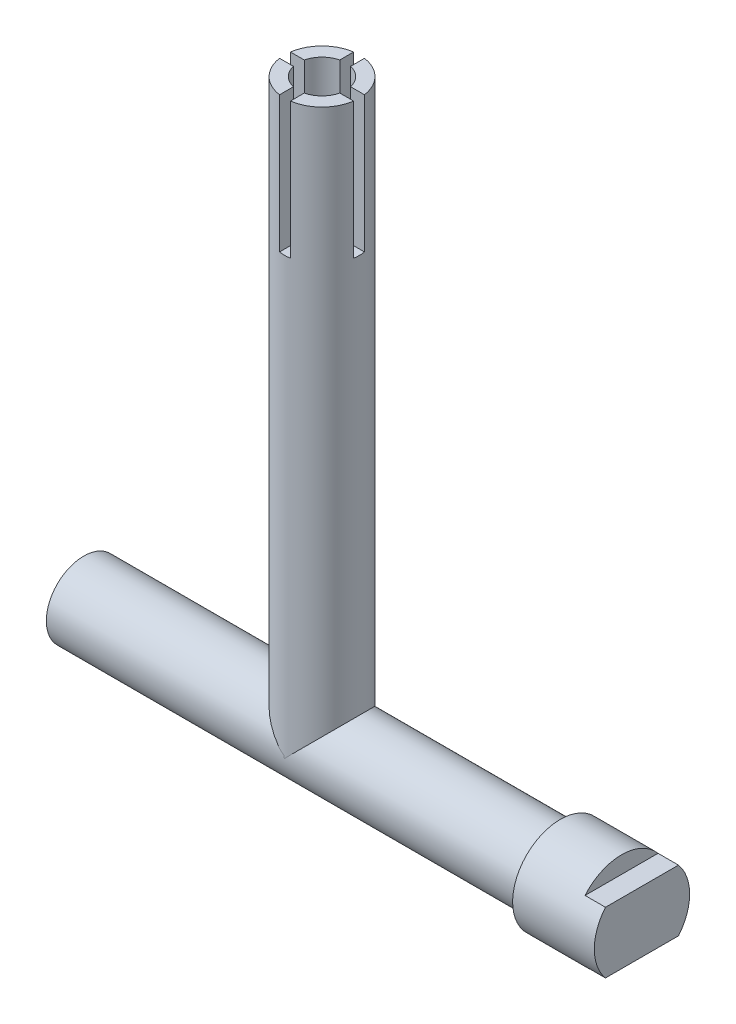
ISO-10303-21;
HEADER;
FILE_DESCRIPTION(('STEP AP214'),'2;1');
FILE_NAME('part.step','',(''),(''),'','','');
FILE_SCHEMA(('AUTOMOTIVE_DESIGN { 1 0 10303 214 1 1 1 1 }'));
ENDSEC;
DATA;
#1=APPLICATION_CONTEXT('core data for automotive mechanical design processes');
#2=APPLICATION_PROTOCOL_DEFINITION('international standard','automotive_design',2000,#1);
#3=PRODUCT_CONTEXT('',#1,'mechanical');
#4=PRODUCT('Part','Part','',(#3));
#5=PRODUCT_RELATED_PRODUCT_CATEGORY('part','',(#4));
#6=PRODUCT_DEFINITION_FORMATION('','',#4);
#7=PRODUCT_DEFINITION_CONTEXT('part definition',#1,'design');
#8=PRODUCT_DEFINITION('design','',#6,#7);
#9=PRODUCT_DEFINITION_SHAPE('','',#8);
#10=(LENGTH_UNIT() NAMED_UNIT(*) SI_UNIT(.MILLI.,.METRE.));
#11=(NAMED_UNIT(*) PLANE_ANGLE_UNIT() SI_UNIT($,.RADIAN.));
#12=(NAMED_UNIT(*) SI_UNIT($,.STERADIAN.) SOLID_ANGLE_UNIT());
#13=UNCERTAINTY_MEASURE_WITH_UNIT(LENGTH_MEASURE(1.E-05),#10,'distance_accuracy_value','');
#14=(GEOMETRIC_REPRESENTATION_CONTEXT(3) GLOBAL_UNCERTAINTY_ASSIGNED_CONTEXT((#13)) GLOBAL_UNIT_ASSIGNED_CONTEXT((#10,
#11,#12)) REPRESENTATION_CONTEXT('',''));
#15=CARTESIAN_POINT('',(0.,0.,0.));
#16=DIRECTION('',(0.,0.,1.));
#17=DIRECTION('',(1.,0.,0.));
#18=AXIS2_PLACEMENT_3D('',#15,#16,#17);
#19=CARTESIAN_POINT('',(35.,0.,0.));
#20=DIRECTION('',(-1.,0.,0.));
#21=DIRECTION('',(0.,0.,1.));
#22=AXIS2_PLACEMENT_3D('',#19,#20,#21);
#23=CYLINDRICAL_SURFACE('',#22,2.75);
#24=CARTESIAN_POINT('',(17.5,0.,0.));
#25=DIRECTION('',(-0.707106781186548,-0.707106781186547,0.));
#26=DIRECTION('',(0.707106781186548,-0.707106781186547,0.));
#27=AXIS2_PLACEMENT_3D('',#24,#25,#26);
#28=ELLIPSE('',#27,3.88908729652601,2.75);
#29=CARTESIAN_POINT('',(17.5,0.,2.75));
#30=VERTEX_POINT('',#29);
#31=CARTESIAN_POINT('',(17.5,0.,-2.75));
#32=VERTEX_POINT('',#31);
#33=EDGE_CURVE('E53',#30,#32,#28,.T.);
#34=ORIENTED_EDGE('',*,*,#33,.T.);
#35=CARTESIAN_POINT('',(17.5,0.,0.));
#36=DIRECTION('',(0.707106781186548,-0.707106781186547,0.));
#37=DIRECTION('',(-0.707106781186548,-0.707106781186547,0.));
#38=AXIS2_PLACEMENT_3D('',#35,#36,#37);
#39=ELLIPSE('',#38,3.88908729652601,2.75);
#40=EDGE_CURVE('E12',#32,#30,#39,.T.);
#41=ORIENTED_EDGE('',*,*,#40,.T.);
#42=EDGE_LOOP('',(#34,#41));
#43=FACE_BOUND('',#42,.T.);
#44=ADVANCED_FACE('F50',(#43),#23,.F.);
#45=CARTESIAN_POINT('',(17.5,42.,0.));
#46=DIRECTION('',(0.,-1.,0.));
#47=DIRECTION('',(0.,0.,-1.));
#48=AXIS2_PLACEMENT_3D('',#45,#46,#47);
#49=CYLINDRICAL_SURFACE('',#48,2.75);
#50=DIRECTION('',(0.,-1.,0.));
#51=VECTOR('',#50,1.);
#52=CARTESIAN_POINT('',(20.2207535720826,42.,-0.400000000000017));
#53=LINE('',#52,#51);
#54=CARTESIAN_POINT('',(20.2207535720826,32.,-0.400000000000017));
#55=VERTEX_POINT('',#54);
#56=CARTESIAN_POINT('',(20.2207535720826,42.,-0.400000000000017));
#57=VERTEX_POINT('',#56);
#58=EDGE_CURVE('E334',#55,#57,#53,.F.);
#59=ORIENTED_EDGE('',*,*,#58,.F.);
#60=CARTESIAN_POINT('',(17.5,32.,0.));
#61=DIRECTION('',(0.,1.,0.));
#62=DIRECTION('',(0.,0.,1.));
#63=AXIS2_PLACEMENT_3D('',#60,#61,#62);
#64=CIRCLE('',#63,2.75);
#65=CARTESIAN_POINT('',(20.2207535720826,32.,0.399999999999982));
#66=VERTEX_POINT('',#65);
#67=EDGE_CURVE('E326',#66,#55,#64,.T.);
#68=ORIENTED_EDGE('',*,*,#67,.F.);
#69=DIRECTION('',(0.,-1.,0.));
#70=VECTOR('',#69,1.);
#71=CARTESIAN_POINT('',(20.2207535720826,42.,0.399999999999982));
#72=LINE('',#71,#70);
#73=CARTESIAN_POINT('',(20.2207535720826,42.,0.399999999999982));
#74=VERTEX_POINT('',#73);
#75=EDGE_CURVE('E331',#66,#74,#72,.F.);
#76=ORIENTED_EDGE('',*,*,#75,.T.);
#77=CARTESIAN_POINT('',(17.5,42.,0.));
#78=DIRECTION('',(0.,1.,0.));
#79=DIRECTION('',(0.,0.,1.));
#80=AXIS2_PLACEMENT_3D('',#77,#78,#79);
#81=CIRCLE('',#80,2.75);
#82=CARTESIAN_POINT('',(17.9,42.,2.72075357208256));
#83=VERTEX_POINT('',#82);
#84=EDGE_CURVE('E208',#83,#74,#81,.T.);
#85=ORIENTED_EDGE('',*,*,#84,.F.);
#86=DIRECTION('',(0.,-1.,0.));
#87=VECTOR('',#86,1.);
#88=CARTESIAN_POINT('',(17.9,42.,2.72075357208256));
#89=LINE('',#88,#87);
#90=CARTESIAN_POINT('',(17.9,32.,2.72075357208256));
#91=VERTEX_POINT('',#90);
#92=EDGE_CURVE('E324',#83,#91,#89,.T.);
#93=ORIENTED_EDGE('',*,*,#92,.T.);
#94=CARTESIAN_POINT('',(17.1,32.,2.72075357208256));
#95=VERTEX_POINT('',#94);
#96=EDGE_CURVE('E312',#95,#91,#64,.T.);
#97=ORIENTED_EDGE('',*,*,#96,.F.);
#98=DIRECTION('',(0.,-1.,0.));
#99=VECTOR('',#98,1.);
#100=CARTESIAN_POINT('',(17.1,42.,2.72075357208256));
#101=LINE('',#100,#99);
#102=CARTESIAN_POINT('',(17.1,42.,2.72075357208256));
#103=VERTEX_POINT('',#102);
#104=EDGE_CURVE('E321',#103,#95,#101,.T.);
#105=ORIENTED_EDGE('',*,*,#104,.F.);
#106=CARTESIAN_POINT('',(14.7792464279174,42.,0.399999999999982));
#107=VERTEX_POINT('',#106);
#108=EDGE_CURVE('E207',#107,#103,#81,.T.);
#109=ORIENTED_EDGE('',*,*,#108,.F.);
#110=DIRECTION('',(0.,-1.,0.));
#111=VECTOR('',#110,1.);
#112=CARTESIAN_POINT('',(14.7792464279174,42.,0.399999999999982));
#113=LINE('',#112,#111);
#114=CARTESIAN_POINT('',(14.7792464279174,32.,0.399999999999982));
#115=VERTEX_POINT('',#114);
#116=EDGE_CURVE('E314',#107,#115,#113,.T.);
#117=ORIENTED_EDGE('',*,*,#116,.T.);
#118=CARTESIAN_POINT('',(14.7792464279174,32.,-0.400000000000017));
#119=VERTEX_POINT('',#118);
#120=EDGE_CURVE('E304',#119,#115,#64,.T.);
#121=ORIENTED_EDGE('',*,*,#120,.F.);
#122=DIRECTION('',(0.,-1.,0.));
#123=VECTOR('',#122,1.);
#124=CARTESIAN_POINT('',(14.7792464279174,42.,-0.400000000000017));
#125=LINE('',#124,#123);
#126=CARTESIAN_POINT('',(14.7792464279174,42.,-0.400000000000017));
#127=VERTEX_POINT('',#126);
#128=EDGE_CURVE('E322',#127,#119,#125,.T.);
#129=ORIENTED_EDGE('',*,*,#128,.F.);
#130=CARTESIAN_POINT('',(17.1,42.,-2.72075357208256));
#131=VERTEX_POINT('',#130);
#132=EDGE_CURVE('E348',#131,#127,#81,.T.);
#133=ORIENTED_EDGE('',*,*,#132,.F.);
#134=DIRECTION('',(0.,-1.,0.));
#135=VECTOR('',#134,1.);
#136=CARTESIAN_POINT('',(17.1,42.,-2.72075357208256));
#137=LINE('',#136,#135);
#138=CARTESIAN_POINT('',(17.1,32.,-2.72075357208256));
#139=VERTEX_POINT('',#138);
#140=EDGE_CURVE('E173',#139,#131,#137,.F.);
#141=ORIENTED_EDGE('',*,*,#140,.F.);
#142=CARTESIAN_POINT('',(17.9,32.,-2.72075357208256));
#143=VERTEX_POINT('',#142);
#144=EDGE_CURVE('E311',#143,#139,#64,.T.);
#145=ORIENTED_EDGE('',*,*,#144,.F.);
#146=DIRECTION('',(0.,-1.,0.));
#147=VECTOR('',#146,1.);
#148=CARTESIAN_POINT('',(17.9,42.,-2.72075357208256));
#149=LINE('',#148,#147);
#150=CARTESIAN_POINT('',(17.9,42.,-2.72075357208256));
#151=VERTEX_POINT('',#150);
#152=EDGE_CURVE('E335',#143,#151,#149,.F.);
#153=ORIENTED_EDGE('',*,*,#152,.T.);
#154=EDGE_CURVE('E212',#57,#151,#81,.T.);
#155=ORIENTED_EDGE('',*,*,#154,.F.);
#156=EDGE_LOOP('',(#59,#68,#76,#85,#93,#97,#105,#109,#117,#121,#129,#133,#141,#145,#153,#155));
#157=FACE_BOUND('',#156,.T.);
#158=ORIENTED_EDGE('',*,*,#33,.F.);
#159=ORIENTED_EDGE('',*,*,#40,.F.);
#160=EDGE_LOOP('',(#158,#159));
#161=FACE_BOUND('',#160,.T.);
#162=ADVANCED_FACE('F233',(#157,#161),#49,.T.);
#163=CARTESIAN_POINT('',(17.5,42.,0.));
#164=DIRECTION('',(0.,1.,0.));
#165=DIRECTION('',(0.,0.,1.));
#166=AXIS2_PLACEMENT_3D('',#163,#164,#165);
#167=PLANE('',#166);
#168=CARTESIAN_POINT('',(17.5,42.,0.));
#169=DIRECTION('',(0.,1.,0.));
#170=DIRECTION('',(0.,0.,1.));
#171=AXIS2_PLACEMENT_3D('',#168,#169,#170);
#172=CIRCLE('',#171,1.75);
#173=CARTESIAN_POINT('',(17.1,42.,-1.70367250374008));
#174=VERTEX_POINT('',#173);
#175=CARTESIAN_POINT('',(15.7963274962599,42.,-0.400000000000017));
#176=VERTEX_POINT('',#175);
#177=EDGE_CURVE('E186',#174,#176,#172,.T.);
#178=ORIENTED_EDGE('',*,*,#177,.F.);
#179=DIRECTION('',(0.,0.,-1.));
#180=VECTOR('',#179,1.);
#181=CARTESIAN_POINT('',(17.1,42.,0.));
#182=LINE('',#181,#180);
#183=EDGE_CURVE('E166',#174,#131,#182,.T.);
#184=ORIENTED_EDGE('',*,*,#183,.T.);
#185=ORIENTED_EDGE('',*,*,#132,.T.);
#186=DIRECTION('',(1.,0.,0.));
#187=VECTOR('',#186,1.);
#188=CARTESIAN_POINT('',(0.,42.,-0.400000000000017));
#189=LINE('',#188,#187);
#190=EDGE_CURVE('E178',#127,#176,#189,.T.);
#191=ORIENTED_EDGE('',*,*,#190,.T.);
#192=EDGE_LOOP('',(#178,#184,#185,#191));
#193=FACE_BOUND('',#192,.T.);
#194=ADVANCED_FACE('F193',(#193),#167,.T.);
#195=DIRECTION('',(0.,0.,-1.));
#196=VECTOR('',#195,1.);
#197=CARTESIAN_POINT('',(17.9,42.,0.));
#198=LINE('',#197,#196);
#199=CARTESIAN_POINT('',(17.9,42.,-1.70367250374008));
#200=VERTEX_POINT('',#199);
#201=EDGE_CURVE('E346',#200,#151,#198,.T.);
#202=ORIENTED_EDGE('',*,*,#201,.F.);
#203=CARTESIAN_POINT('',(19.2036725037401,42.,-0.400000000000017));
#204=VERTEX_POINT('',#203);
#205=EDGE_CURVE('E194',#204,#200,#172,.T.);
#206=ORIENTED_EDGE('',*,*,#205,.F.);
#207=DIRECTION('',(1.,0.,0.));
#208=VECTOR('',#207,1.);
#209=CARTESIAN_POINT('',(0.,42.,-0.400000000000017));
#210=LINE('',#209,#208);
#211=EDGE_CURVE('E347',#204,#57,#210,.T.);
#212=ORIENTED_EDGE('',*,*,#211,.T.);
#213=ORIENTED_EDGE('',*,*,#154,.T.);
#214=EDGE_LOOP('',(#202,#206,#212,#213));
#215=FACE_BOUND('',#214,.T.);
#216=ADVANCED_FACE('F240',(#215),#167,.T.);
#217=ORIENTED_EDGE('',*,*,#108,.T.);
#218=DIRECTION('',(0.,0.,-1.));
#219=VECTOR('',#218,1.);
#220=CARTESIAN_POINT('',(17.1,42.,0.));
#221=LINE('',#220,#219);
#222=CARTESIAN_POINT('',(17.1,42.,1.70367250374008));
#223=VERTEX_POINT('',#222);
#224=EDGE_CURVE('E351',#103,#223,#221,.T.);
#225=ORIENTED_EDGE('',*,*,#224,.T.);
#226=CARTESIAN_POINT('',(15.7963274962599,42.,0.399999999999982));
#227=VERTEX_POINT('',#226);
#228=EDGE_CURVE('E195',#227,#223,#172,.T.);
#229=ORIENTED_EDGE('',*,*,#228,.F.);
#230=DIRECTION('',(1.,0.,0.));
#231=VECTOR('',#230,1.);
#232=CARTESIAN_POINT('',(0.,42.,0.399999999999982));
#233=LINE('',#232,#231);
#234=EDGE_CURVE('E352',#107,#227,#233,.T.);
#235=ORIENTED_EDGE('',*,*,#234,.F.);
#236=EDGE_LOOP('',(#217,#225,#229,#235));
#237=FACE_BOUND('',#236,.T.);
#238=ADVANCED_FACE('F249',(#237),#167,.T.);
#239=CARTESIAN_POINT('',(17.5,42.,0.));
#240=DIRECTION('',(0.,1.,0.));
#241=DIRECTION('',(0.,0.,1.));
#242=AXIS2_PLACEMENT_3D('',#239,#240,#241);
#243=CYLINDRICAL_SURFACE('',#242,1.75);
#244=CARTESIAN_POINT('',(17.5,32.,0.));
#245=DIRECTION('',(0.,1.,0.));
#246=DIRECTION('',(0.,0.,1.));
#247=AXIS2_PLACEMENT_3D('',#244,#245,#246);
#248=CIRCLE('',#247,1.75);
#249=CARTESIAN_POINT('',(15.7963274962599,32.,0.399999999999982));
#250=VERTEX_POINT('',#249);
#251=CARTESIAN_POINT('',(15.7963274962599,32.,-0.400000000000017));
#252=VERTEX_POINT('',#251);
#253=EDGE_CURVE('E189',#250,#252,#248,.F.);
#254=ORIENTED_EDGE('',*,*,#253,.F.);
#255=DIRECTION('',(0.,1.,0.));
#256=VECTOR('',#255,1.);
#257=CARTESIAN_POINT('',(15.7963274962599,42.,0.399999999999982));
#258=LINE('',#257,#256);
#259=EDGE_CURVE('E229',#250,#227,#258,.T.);
#260=ORIENTED_EDGE('',*,*,#259,.T.);
#261=ORIENTED_EDGE('',*,*,#228,.T.);
#262=DIRECTION('',(0.,1.,0.));
#263=VECTOR('',#262,1.);
#264=CARTESIAN_POINT('',(17.1,42.,1.70367250374008));
#265=LINE('',#264,#263);
#266=CARTESIAN_POINT('',(17.1,32.,1.70367250374008));
#267=VERTEX_POINT('',#266);
#268=EDGE_CURVE('E214',#267,#223,#265,.T.);
#269=ORIENTED_EDGE('',*,*,#268,.F.);
#270=CARTESIAN_POINT('',(17.9,32.,1.70367250374008));
#271=VERTEX_POINT('',#270);
#272=EDGE_CURVE('E211',#271,#267,#248,.F.);
#273=ORIENTED_EDGE('',*,*,#272,.F.);
#274=DIRECTION('',(0.,1.,0.));
#275=VECTOR('',#274,1.);
#276=CARTESIAN_POINT('',(17.9,42.,1.70367250374008));
#277=LINE('',#276,#275);
#278=CARTESIAN_POINT('',(17.9,42.,1.70367250374008));
#279=VERTEX_POINT('',#278);
#280=EDGE_CURVE('E217',#271,#279,#277,.T.);
#281=ORIENTED_EDGE('',*,*,#280,.T.);
#282=CARTESIAN_POINT('',(19.2036725037401,42.,0.399999999999982));
#283=VERTEX_POINT('',#282);
#284=EDGE_CURVE('E198',#279,#283,#172,.T.);
#285=ORIENTED_EDGE('',*,*,#284,.T.);
#286=DIRECTION('',(0.,1.,0.));
#287=VECTOR('',#286,1.);
#288=CARTESIAN_POINT('',(19.2036725037401,42.,0.399999999999982));
#289=LINE('',#288,#287);
#290=CARTESIAN_POINT('',(19.2036725037401,32.,0.399999999999982));
#291=VERTEX_POINT('',#290);
#292=EDGE_CURVE('E220',#283,#291,#289,.F.);
#293=ORIENTED_EDGE('',*,*,#292,.T.);
#294=CARTESIAN_POINT('',(19.2036725037401,32.,-0.400000000000017));
#295=VERTEX_POINT('',#294);
#296=EDGE_CURVE('E215',#295,#291,#248,.F.);
#297=ORIENTED_EDGE('',*,*,#296,.F.);
#298=DIRECTION('',(0.,1.,0.));
#299=VECTOR('',#298,1.);
#300=CARTESIAN_POINT('',(19.2036725037401,42.,-0.400000000000017));
#301=LINE('',#300,#299);
#302=EDGE_CURVE('E223',#204,#295,#301,.F.);
#303=ORIENTED_EDGE('',*,*,#302,.F.);
#304=ORIENTED_EDGE('',*,*,#205,.T.);
#305=DIRECTION('',(0.,1.,0.));
#306=VECTOR('',#305,1.);
#307=CARTESIAN_POINT('',(17.9,42.,-1.70367250374008));
#308=LINE('',#307,#306);
#309=CARTESIAN_POINT('',(17.9,32.,-1.70367250374008));
#310=VERTEX_POINT('',#309);
#311=EDGE_CURVE('E190',#200,#310,#308,.F.);
#312=ORIENTED_EDGE('',*,*,#311,.T.);
#313=CARTESIAN_POINT('',(17.1,32.,-1.70367250374008));
#314=VERTEX_POINT('',#313);
#315=EDGE_CURVE('E188',#314,#310,#248,.F.);
#316=ORIENTED_EDGE('',*,*,#315,.F.);
#317=DIRECTION('',(0.,1.,0.));
#318=VECTOR('',#317,1.);
#319=CARTESIAN_POINT('',(17.1,42.,-1.70367250374008));
#320=LINE('',#319,#318);
#321=EDGE_CURVE('E170',#174,#314,#320,.F.);
#322=ORIENTED_EDGE('',*,*,#321,.F.);
#323=ORIENTED_EDGE('',*,*,#177,.T.);
#324=DIRECTION('',(0.,1.,0.));
#325=VECTOR('',#324,1.);
#326=CARTESIAN_POINT('',(15.7963274962599,42.,-0.400000000000017));
#327=LINE('',#326,#325);
#328=EDGE_CURVE('E227',#252,#176,#327,.T.);
#329=ORIENTED_EDGE('',*,*,#328,.F.);
#330=EDGE_LOOP('',(#254,#260,#261,#269,#273,#281,#285,#293,#297,#303,#304,#312,#316,#322,#323,#329));
#331=FACE_BOUND('',#330,.T.);
#332=CARTESIAN_POINT('',(17.5,29.,0.));
#333=DIRECTION('',(0.,1.,0.));
#334=DIRECTION('',(0.,0.,1.));
#335=AXIS2_PLACEMENT_3D('',#332,#333,#334);
#336=CIRCLE('',#335,1.75);
#337=CARTESIAN_POINT('',(17.5,29.,1.75));
#338=VERTEX_POINT('',#337);
#339=EDGE_CURVE('E203',#338,#338,#336,.T.);
#340=ORIENTED_EDGE('',*,*,#339,.F.);
#341=EDGE_LOOP('',(#340));
#342=FACE_BOUND('',#341,.T.);
#343=ADVANCED_FACE('F183',(#331,#342),#243,.F.);
#344=DIRECTION('',(1.,0.,0.));
#345=VECTOR('',#344,1.);
#346=CARTESIAN_POINT('',(0.,42.,0.399999999999982));
#347=LINE('',#346,#345);
#348=EDGE_CURVE('E359',#283,#74,#347,.T.);
#349=ORIENTED_EDGE('',*,*,#348,.F.);
#350=ORIENTED_EDGE('',*,*,#284,.F.);
#351=DIRECTION('',(0.,0.,-1.));
#352=VECTOR('',#351,1.);
#353=CARTESIAN_POINT('',(17.9,42.,0.));
#354=LINE('',#353,#352);
#355=EDGE_CURVE('E354',#83,#279,#354,.T.);
#356=ORIENTED_EDGE('',*,*,#355,.F.);
#357=ORIENTED_EDGE('',*,*,#84,.T.);
#358=EDGE_LOOP('',(#349,#350,#356,#357));
#359=FACE_BOUND('',#358,.T.);
#360=ADVANCED_FACE('F242',(#359),#167,.T.);
#361=CARTESIAN_POINT('',(17.5,29.,0.));
#362=DIRECTION('',(0.,1.,0.));
#363=DIRECTION('',(0.,0.,1.));
#364=AXIS2_PLACEMENT_3D('',#361,#362,#363);
#365=CONICAL_SURFACE('',#364,1.75,1.02974425867665);
#366=CARTESIAN_POINT('',(17.5,27.9484939167018,0.));
#367=VERTEX_POINT('',#366);
#368=VERTEX_LOOP('',#367);
#369=FACE_BOUND('',#368,.T.);
#370=ORIENTED_EDGE('',*,*,#339,.T.);
#371=EDGE_LOOP('',(#370));
#372=FACE_BOUND('',#371,.T.);
#373=ADVANCED_FACE('F247',(#369,#372),#365,.F.);
#374=CARTESIAN_POINT('',(0.,32.,0.));
#375=DIRECTION('',(0.,1.,0.));
#376=DIRECTION('',(0.,0.,1.));
#377=AXIS2_PLACEMENT_3D('',#374,#375,#376);
#378=PLANE('',#377);
#379=ORIENTED_EDGE('',*,*,#96,.T.);
#380=DIRECTION('',(0.,0.,-1.));
#381=VECTOR('',#380,1.);
#382=CARTESIAN_POINT('',(17.9,32.,0.));
#383=LINE('',#382,#381);
#384=EDGE_CURVE('E378',#91,#271,#383,.T.);
#385=ORIENTED_EDGE('',*,*,#384,.T.);
#386=ORIENTED_EDGE('',*,*,#272,.T.);
#387=DIRECTION('',(0.,0.,-1.));
#388=VECTOR('',#387,1.);
#389=CARTESIAN_POINT('',(17.1,32.,0.));
#390=LINE('',#389,#388);
#391=EDGE_CURVE('E316',#95,#267,#390,.T.);
#392=ORIENTED_EDGE('',*,*,#391,.F.);
#393=EDGE_LOOP('',(#379,#385,#386,#392));
#394=FACE_BOUND('',#393,.T.);
#395=ADVANCED_FACE('F252',(#394),#378,.T.);
#396=CARTESIAN_POINT('',(17.1,32.,0.));
#397=DIRECTION('',(1.,0.,0.));
#398=DIRECTION('',(0.,0.,-1.));
#399=AXIS2_PLACEMENT_3D('',#396,#397,#398);
#400=PLANE('',#399);
#401=ORIENTED_EDGE('',*,*,#104,.T.);
#402=ORIENTED_EDGE('',*,*,#391,.T.);
#403=ORIENTED_EDGE('',*,*,#268,.T.);
#404=ORIENTED_EDGE('',*,*,#224,.F.);
#405=EDGE_LOOP('',(#401,#402,#403,#404));
#406=FACE_BOUND('',#405,.T.);
#407=ADVANCED_FACE('F267',(#406),#400,.T.);
#408=CARTESIAN_POINT('',(17.9,32.,0.));
#409=DIRECTION('',(1.,0.,0.));
#410=DIRECTION('',(0.,0.,-1.));
#411=AXIS2_PLACEMENT_3D('',#408,#409,#410);
#412=PLANE('',#411);
#413=ORIENTED_EDGE('',*,*,#355,.T.);
#414=ORIENTED_EDGE('',*,*,#280,.F.);
#415=ORIENTED_EDGE('',*,*,#384,.F.);
#416=ORIENTED_EDGE('',*,*,#92,.F.);
#417=EDGE_LOOP('',(#413,#414,#415,#416));
#418=FACE_BOUND('',#417,.T.);
#419=ADVANCED_FACE('F270',(#418),#412,.F.);
#420=ORIENTED_EDGE('',*,*,#67,.T.);
#421=DIRECTION('',(1.,0.,0.));
#422=VECTOR('',#421,1.);
#423=CARTESIAN_POINT('',(0.,32.,-0.400000000000017));
#424=LINE('',#423,#422);
#425=EDGE_CURVE('E367',#295,#55,#424,.T.);
#426=ORIENTED_EDGE('',*,*,#425,.F.);
#427=ORIENTED_EDGE('',*,*,#296,.T.);
#428=DIRECTION('',(1.,0.,0.));
#429=VECTOR('',#428,1.);
#430=CARTESIAN_POINT('',(0.,32.,0.399999999999982));
#431=LINE('',#430,#429);
#432=EDGE_CURVE('E375',#291,#66,#431,.T.);
#433=ORIENTED_EDGE('',*,*,#432,.T.);
#434=EDGE_LOOP('',(#420,#426,#427,#433));
#435=FACE_BOUND('',#434,.T.);
#436=ADVANCED_FACE('F274',(#435),#378,.T.);
#437=CARTESIAN_POINT('',(0.,32.,0.399999999999982));
#438=DIRECTION('',(0.,0.,1.));
#439=DIRECTION('',(1.,0.,0.));
#440=AXIS2_PLACEMENT_3D('',#437,#438,#439);
#441=PLANE('',#440);
#442=ORIENTED_EDGE('',*,*,#432,.F.);
#443=ORIENTED_EDGE('',*,*,#292,.F.);
#444=ORIENTED_EDGE('',*,*,#348,.T.);
#445=ORIENTED_EDGE('',*,*,#75,.F.);
#446=EDGE_LOOP('',(#442,#443,#444,#445));
#447=FACE_BOUND('',#446,.T.);
#448=ADVANCED_FACE('F276',(#447),#441,.F.);
#449=CARTESIAN_POINT('',(0.,32.,-0.400000000000017));
#450=DIRECTION('',(0.,0.,1.));
#451=DIRECTION('',(1.,0.,0.));
#452=AXIS2_PLACEMENT_3D('',#449,#450,#451);
#453=PLANE('',#452);
#454=ORIENTED_EDGE('',*,*,#58,.T.);
#455=ORIENTED_EDGE('',*,*,#211,.F.);
#456=ORIENTED_EDGE('',*,*,#302,.T.);
#457=ORIENTED_EDGE('',*,*,#425,.T.);
#458=EDGE_LOOP('',(#454,#455,#456,#457));
#459=FACE_BOUND('',#458,.T.);
#460=ADVANCED_FACE('F279',(#459),#453,.T.);
#461=ORIENTED_EDGE('',*,*,#144,.T.);
#462=DIRECTION('',(0.,0.,-1.));
#463=VECTOR('',#462,1.);
#464=CARTESIAN_POINT('',(17.1,32.,0.));
#465=LINE('',#464,#463);
#466=EDGE_CURVE('E362',#314,#139,#465,.T.);
#467=ORIENTED_EDGE('',*,*,#466,.F.);
#468=ORIENTED_EDGE('',*,*,#315,.T.);
#469=DIRECTION('',(0.,0.,-1.));
#470=VECTOR('',#469,1.);
#471=CARTESIAN_POINT('',(17.9,32.,0.));
#472=LINE('',#471,#470);
#473=EDGE_CURVE('E363',#310,#143,#472,.T.);
#474=ORIENTED_EDGE('',*,*,#473,.T.);
#475=EDGE_LOOP('',(#461,#467,#468,#474));
#476=FACE_BOUND('',#475,.T.);
#477=ADVANCED_FACE('F283',(#476),#378,.T.);
#478=CARTESIAN_POINT('',(17.9,32.,0.));
#479=DIRECTION('',(1.,0.,0.));
#480=DIRECTION('',(0.,0.,-1.));
#481=AXIS2_PLACEMENT_3D('',#478,#479,#480);
#482=PLANE('',#481);
#483=ORIENTED_EDGE('',*,*,#473,.F.);
#484=ORIENTED_EDGE('',*,*,#311,.F.);
#485=ORIENTED_EDGE('',*,*,#201,.T.);
#486=ORIENTED_EDGE('',*,*,#152,.F.);
#487=EDGE_LOOP('',(#483,#484,#485,#486));
#488=FACE_BOUND('',#487,.T.);
#489=ADVANCED_FACE('F259',(#488),#482,.F.);
#490=CARTESIAN_POINT('',(17.1,32.,0.));
#491=DIRECTION('',(1.,0.,0.));
#492=DIRECTION('',(0.,0.,-1.));
#493=AXIS2_PLACEMENT_3D('',#490,#491,#492);
#494=PLANE('',#493);
#495=ORIENTED_EDGE('',*,*,#140,.T.);
#496=ORIENTED_EDGE('',*,*,#183,.F.);
#497=ORIENTED_EDGE('',*,*,#321,.T.);
#498=ORIENTED_EDGE('',*,*,#466,.T.);
#499=EDGE_LOOP('',(#495,#496,#497,#498));
#500=FACE_BOUND('',#499,.T.);
#501=ADVANCED_FACE('F168',(#500),#494,.T.);
#502=CARTESIAN_POINT('',(0.,32.,0.399999999999982));
#503=DIRECTION('',(0.,0.,1.));
#504=DIRECTION('',(1.,0.,0.));
#505=AXIS2_PLACEMENT_3D('',#502,#503,#504);
#506=PLANE('',#505);
#507=ORIENTED_EDGE('',*,*,#234,.T.);
#508=ORIENTED_EDGE('',*,*,#259,.F.);
#509=DIRECTION('',(1.,0.,0.));
#510=VECTOR('',#509,1.);
#511=CARTESIAN_POINT('',(0.,32.,0.399999999999982));
#512=LINE('',#511,#510);
#513=EDGE_CURVE('E306',#115,#250,#512,.T.);
#514=ORIENTED_EDGE('',*,*,#513,.F.);
#515=ORIENTED_EDGE('',*,*,#116,.F.);
#516=EDGE_LOOP('',(#507,#508,#514,#515));
#517=FACE_BOUND('',#516,.T.);
#518=ADVANCED_FACE('F258',(#517),#506,.F.);
#519=CARTESIAN_POINT('',(0.,32.,-0.400000000000017));
#520=DIRECTION('',(0.,0.,1.));
#521=DIRECTION('',(1.,0.,0.));
#522=AXIS2_PLACEMENT_3D('',#519,#520,#521);
#523=PLANE('',#522);
#524=ORIENTED_EDGE('',*,*,#128,.T.);
#525=DIRECTION('',(1.,0.,0.));
#526=VECTOR('',#525,1.);
#527=CARTESIAN_POINT('',(0.,32.,-0.400000000000017));
#528=LINE('',#527,#526);
#529=EDGE_CURVE('E308',#119,#252,#528,.T.);
#530=ORIENTED_EDGE('',*,*,#529,.T.);
#531=ORIENTED_EDGE('',*,*,#328,.T.);
#532=ORIENTED_EDGE('',*,*,#190,.F.);
#533=EDGE_LOOP('',(#524,#530,#531,#532));
#534=FACE_BOUND('',#533,.T.);
#535=ADVANCED_FACE('F260',(#534),#523,.T.);
#536=ORIENTED_EDGE('',*,*,#120,.T.);
#537=ORIENTED_EDGE('',*,*,#513,.T.);
#538=ORIENTED_EDGE('',*,*,#253,.T.);
#539=ORIENTED_EDGE('',*,*,#529,.F.);
#540=EDGE_LOOP('',(#536,#537,#538,#539));
#541=FACE_BOUND('',#540,.T.);
#542=ADVANCED_FACE('F243',(#541),#378,.T.);
#543=CLOSED_SHELL('',(#44,#162,#194,#216,#238,#343,#360,#373,#395,#407,#419,#436,#448,#460,#477,
#489,#501,#518,#535,#542));
#544=MANIFOLD_SOLID_BREP('B2',#543);
#545=CARTESIAN_POINT('',(41.,0.,0.));
#546=DIRECTION('',(-1.,0.,0.));
#547=DIRECTION('',(0.,0.,1.));
#548=AXIS2_PLACEMENT_3D('',#545,#546,#547);
#549=CYLINDRICAL_SURFACE('',#548,3.5);
#550=CARTESIAN_POINT('',(35.,0.,0.));
#551=DIRECTION('',(1.,0.,0.));
#552=DIRECTION('',(0.,0.,-1.));
#553=AXIS2_PLACEMENT_3D('',#550,#551,#552);
#554=CIRCLE('',#553,3.5);
#555=CARTESIAN_POINT('',(35.,0.,-3.5));
#556=VERTEX_POINT('',#555);
#557=EDGE_CURVE('E727',#556,#556,#554,.T.);
#558=ORIENTED_EDGE('',*,*,#557,.T.);
#559=EDGE_LOOP('',(#558));
#560=FACE_BOUND('',#559,.T.);
#561=DIRECTION('',(1.,0.,0.));
#562=VECTOR('',#561,1.);
#563=CARTESIAN_POINT('',(39.5,-2.25,2.6809513236909));
#564=LINE('',#563,#562);
#565=CARTESIAN_POINT('',(39.5,-2.25,2.6809513236909));
#566=VERTEX_POINT('',#565);
#567=CARTESIAN_POINT('',(41.,-2.25,2.6809513236909));
#568=VERTEX_POINT('',#567);
#569=EDGE_CURVE('E712',#566,#568,#564,.T.);
#570=ORIENTED_EDGE('',*,*,#569,.T.);
#571=CARTESIAN_POINT('',(41.,0.,0.));
#572=DIRECTION('',(1.,0.,0.));
#573=DIRECTION('',(0.,0.,-1.));
#574=AXIS2_PLACEMENT_3D('',#571,#572,#573);
#575=CIRCLE('',#574,3.5);
#576=CARTESIAN_POINT('',(41.,2.25,2.6809513236909));
#577=VERTEX_POINT('',#576);
#578=EDGE_CURVE('E729',#577,#568,#575,.T.);
#579=ORIENTED_EDGE('',*,*,#578,.F.);
#580=DIRECTION('',(1.,0.,0.));
#581=VECTOR('',#580,1.);
#582=CARTESIAN_POINT('',(39.5,2.25,2.6809513236909));
#583=LINE('',#582,#581);
#584=CARTESIAN_POINT('',(39.5,2.25,2.6809513236909));
#585=VERTEX_POINT('',#584);
#586=EDGE_CURVE('E664',#585,#577,#583,.T.);
#587=ORIENTED_EDGE('',*,*,#586,.F.);
#588=CARTESIAN_POINT('',(39.5,0.,0.));
#589=DIRECTION('',(1.,0.,0.));
#590=DIRECTION('',(0.,0.,-1.));
#591=AXIS2_PLACEMENT_3D('',#588,#589,#590);
#592=CIRCLE('',#591,3.5);
#593=CARTESIAN_POINT('',(39.5,2.25,-2.6809513236909));
#594=VERTEX_POINT('',#593);
#595=EDGE_CURVE('E718',#594,#585,#592,.T.);
#596=ORIENTED_EDGE('',*,*,#595,.F.);
#597=DIRECTION('',(1.,0.,0.));
#598=VECTOR('',#597,1.);
#599=CARTESIAN_POINT('',(39.5,2.25,-2.6809513236909));
#600=LINE('',#599,#598);
#601=CARTESIAN_POINT('',(41.,2.25,-2.6809513236909));
#602=VERTEX_POINT('',#601);
#603=EDGE_CURVE('E724',#594,#602,#600,.T.);
#604=ORIENTED_EDGE('',*,*,#603,.T.);
#605=CARTESIAN_POINT('',(41.,-2.25,-2.6809513236909));
#606=VERTEX_POINT('',#605);
#607=EDGE_CURVE('E732',#606,#602,#575,.T.);
#608=ORIENTED_EDGE('',*,*,#607,.F.);
#609=DIRECTION('',(1.,0.,0.));
#610=VECTOR('',#609,1.);
#611=CARTESIAN_POINT('',(39.5,-2.25,-2.6809513236909));
#612=LINE('',#611,#610);
#613=CARTESIAN_POINT('',(39.5,-2.25,-2.6809513236909));
#614=VERTEX_POINT('',#613);
#615=EDGE_CURVE('E656',#614,#606,#612,.T.);
#616=ORIENTED_EDGE('',*,*,#615,.F.);
#617=CARTESIAN_POINT('',(39.5,0.,0.));
#618=DIRECTION('',(1.,0.,0.));
#619=DIRECTION('',(0.,0.,-1.));
#620=AXIS2_PLACEMENT_3D('',#617,#618,#619);
#621=CIRCLE('',#620,3.5);
#622=EDGE_CURVE('E709',#566,#614,#621,.T.);
#623=ORIENTED_EDGE('',*,*,#622,.F.);
#624=EDGE_LOOP('',(#570,#579,#587,#596,#604,#608,#616,#623));
#625=FACE_BOUND('',#624,.T.);
#626=ADVANCED_FACE('F641',(#560,#625),#549,.T.);
#627=CARTESIAN_POINT('',(41.,0.,0.));
#628=DIRECTION('',(1.,0.,0.));
#629=DIRECTION('',(0.,0.,-1.));
#630=AXIS2_PLACEMENT_3D('',#627,#628,#629);
#631=PLANE('',#630);
#632=ORIENTED_EDGE('',*,*,#578,.T.);
#633=DIRECTION('',(0.,0.,-1.));
#634=VECTOR('',#633,1.);
#635=CARTESIAN_POINT('',(41.,-2.25,0.));
#636=LINE('',#635,#634);
#637=EDGE_CURVE('E705',#568,#606,#636,.T.);
#638=ORIENTED_EDGE('',*,*,#637,.T.);
#639=ORIENTED_EDGE('',*,*,#607,.T.);
#640=DIRECTION('',(0.,0.,-1.));
#641=VECTOR('',#640,1.);
#642=CARTESIAN_POINT('',(41.,2.25,0.));
#643=LINE('',#642,#641);
#644=EDGE_CURVE('E715',#577,#602,#643,.T.);
#645=ORIENTED_EDGE('',*,*,#644,.F.);
#646=EDGE_LOOP('',(#632,#638,#639,#645));
#647=FACE_BOUND('',#646,.T.);
#648=ADVANCED_FACE('F738',(#647),#631,.T.);
#649=CARTESIAN_POINT('',(35.,0.,0.));
#650=DIRECTION('',(-1.,0.,0.));
#651=DIRECTION('',(0.,0.,1.));
#652=AXIS2_PLACEMENT_3D('',#649,#650,#651);
#653=CYLINDRICAL_SURFACE('',#652,2.75);
#654=CARTESIAN_POINT('',(35.,0.,0.));
#655=DIRECTION('',(1.,0.,0.));
#656=DIRECTION('',(0.,0.,-1.));
#657=AXIS2_PLACEMENT_3D('',#654,#655,#656);
#658=CIRCLE('',#657,2.75);
#659=CARTESIAN_POINT('',(35.,0.,-2.75));
#660=VERTEX_POINT('',#659);
#661=EDGE_CURVE('E48',#660,#660,#658,.T.);
#662=ORIENTED_EDGE('',*,*,#661,.F.);
#663=EDGE_LOOP('',(#662));
#664=FACE_BOUND('',#663,.T.);
#665=CARTESIAN_POINT('',(0.,0.,0.));
#666=DIRECTION('',(1.,0.,0.));
#667=DIRECTION('',(0.,0.,-1.));
#668=AXIS2_PLACEMENT_3D('',#665,#666,#667);
#669=CIRCLE('',#668,2.75);
#670=CARTESIAN_POINT('',(0.,0.,-2.75));
#671=VERTEX_POINT('',#670);
#672=EDGE_CURVE('E645',#671,#671,#669,.T.);
#673=ORIENTED_EDGE('',*,*,#672,.T.);
#674=EDGE_LOOP('',(#673));
#675=FACE_BOUND('',#674,.T.);
#676=ADVANCED_FACE('F643',(#664,#675),#653,.T.);
#677=CARTESIAN_POINT('',(0.,0.,0.));
#678=DIRECTION('',(1.,0.,0.));
#679=DIRECTION('',(0.,0.,-1.));
#680=AXIS2_PLACEMENT_3D('',#677,#678,#679);
#681=PLANE('',#680);
#682=CARTESIAN_POINT('',(0.,0.,0.));
#683=DIRECTION('',(-1.,0.,0.));
#684=DIRECTION('',(0.,0.,1.));
#685=AXIS2_PLACEMENT_3D('',#682,#683,#684);
#686=CIRCLE('',#685,2.);
#687=CARTESIAN_POINT('',(0.,0.,2.));
#688=VERTEX_POINT('',#687);
#689=EDGE_CURVE('E695',#688,#688,#686,.T.);
#690=ORIENTED_EDGE('',*,*,#689,.F.);
#691=EDGE_LOOP('',(#690));
#692=FACE_BOUND('',#691,.T.);
#693=ORIENTED_EDGE('',*,*,#672,.F.);
#694=EDGE_LOOP('',(#693));
#695=FACE_BOUND('',#694,.T.);
#696=ADVANCED_FACE('F763',(#692,#695),#681,.F.);
#697=CARTESIAN_POINT('',(35.,0.,0.));
#698=DIRECTION('',(1.,0.,0.));
#699=DIRECTION('',(0.,0.,-1.));
#700=AXIS2_PLACEMENT_3D('',#697,#698,#699);
#701=PLANE('',#700);
#702=ORIENTED_EDGE('',*,*,#557,.F.);
#703=EDGE_LOOP('',(#702));
#704=FACE_BOUND('',#703,.T.);
#705=ORIENTED_EDGE('',*,*,#661,.T.);
#706=EDGE_LOOP('',(#705));
#707=FACE_BOUND('',#706,.T.);
#708=ADVANCED_FACE('F754',(#704,#707),#701,.F.);
#709=CARTESIAN_POINT('',(39.5,2.25,0.));
#710=DIRECTION('',(0.,-1.,0.));
#711=DIRECTION('',(0.,0.,-1.));
#712=AXIS2_PLACEMENT_3D('',#709,#710,#711);
#713=PLANE('',#712);
#714=ORIENTED_EDGE('',*,*,#644,.T.);
#715=ORIENTED_EDGE('',*,*,#603,.F.);
#716=DIRECTION('',(0.,0.,-1.));
#717=VECTOR('',#716,1.);
#718=CARTESIAN_POINT('',(39.5,2.25,0.));
#719=LINE('',#718,#717);
#720=EDGE_CURVE('E720',#585,#594,#719,.T.);
#721=ORIENTED_EDGE('',*,*,#720,.F.);
#722=ORIENTED_EDGE('',*,*,#586,.T.);
#723=EDGE_LOOP('',(#714,#715,#721,#722));
#724=FACE_BOUND('',#723,.T.);
#725=ADVANCED_FACE('F741',(#724),#713,.F.);
#726=CARTESIAN_POINT('',(39.5,0.,0.));
#727=DIRECTION('',(1.,0.,0.));
#728=DIRECTION('',(0.,0.,-1.));
#729=AXIS2_PLACEMENT_3D('',#726,#727,#728);
#730=PLANE('',#729);
#731=ORIENTED_EDGE('',*,*,#595,.T.);
#732=ORIENTED_EDGE('',*,*,#720,.T.);
#733=EDGE_LOOP('',(#731,#732));
#734=FACE_BOUND('',#733,.T.);
#735=ADVANCED_FACE('F744',(#734),#730,.T.);
#736=CARTESIAN_POINT('',(39.5,-2.25,0.));
#737=DIRECTION('',(0.,-1.,0.));
#738=DIRECTION('',(0.,0.,-1.));
#739=AXIS2_PLACEMENT_3D('',#736,#737,#738);
#740=PLANE('',#739);
#741=ORIENTED_EDGE('',*,*,#637,.F.);
#742=ORIENTED_EDGE('',*,*,#569,.F.);
#743=DIRECTION('',(0.,0.,-1.));
#744=VECTOR('',#743,1.);
#745=CARTESIAN_POINT('',(39.5,-2.25,0.));
#746=LINE('',#745,#744);
#747=EDGE_CURVE('E707',#566,#614,#746,.T.);
#748=ORIENTED_EDGE('',*,*,#747,.T.);
#749=ORIENTED_EDGE('',*,*,#615,.T.);
#750=EDGE_LOOP('',(#741,#742,#748,#749));
#751=FACE_BOUND('',#750,.T.);
#752=ADVANCED_FACE('F746',(#751),#740,.T.);
#753=CARTESIAN_POINT('',(39.5,0.,0.));
#754=DIRECTION('',(1.,0.,0.));
#755=DIRECTION('',(0.,0.,-1.));
#756=AXIS2_PLACEMENT_3D('',#753,#754,#755);
#757=PLANE('',#756);
#758=ORIENTED_EDGE('',*,*,#747,.F.);
#759=ORIENTED_EDGE('',*,*,#622,.T.);
#760=EDGE_LOOP('',(#758,#759));
#761=FACE_BOUND('',#760,.T.);
#762=ADVANCED_FACE('F752',(#761),#757,.T.);
#763=CARTESIAN_POINT('',(7.,0.,0.));
#764=DIRECTION('',(-1.,0.,0.));
#765=DIRECTION('',(0.,0.,1.));
#766=AXIS2_PLACEMENT_3D('',#763,#764,#765);
#767=CYLINDRICAL_SURFACE('',#766,2.);
#768=CARTESIAN_POINT('',(7.,0.,0.));
#769=DIRECTION('',(-1.,0.,0.));
#770=DIRECTION('',(0.,0.,1.));
#771=AXIS2_PLACEMENT_3D('',#768,#769,#770);
#772=CIRCLE('',#771,2.);
#773=CARTESIAN_POINT('',(7.,0.,2.));
#774=VERTEX_POINT('',#773);
#775=EDGE_CURVE('E699',#774,#774,#772,.T.);
#776=ORIENTED_EDGE('',*,*,#775,.F.);
#777=EDGE_LOOP('',(#776));
#778=FACE_BOUND('',#777,.T.);
#779=ORIENTED_EDGE('',*,*,#689,.T.);
#780=EDGE_LOOP('',(#779));
#781=FACE_BOUND('',#780,.T.);
#782=ADVANCED_FACE('F778',(#778,#781),#767,.F.);
#783=CARTESIAN_POINT('',(7.,0.,0.));
#784=DIRECTION('',(-1.,0.,0.));
#785=DIRECTION('',(0.,0.,1.));
#786=AXIS2_PLACEMENT_3D('',#783,#784,#785);
#787=PLANE('',#786);
#788=CARTESIAN_POINT('',(7.,0.,0.));
#789=DIRECTION('',(-1.,0.,0.));
#790=DIRECTION('',(0.,0.,1.));
#791=AXIS2_PLACEMENT_3D('',#788,#789,#790);
#792=CIRCLE('',#791,1.025);
#793=CARTESIAN_POINT('',(7.,0.,1.025));
#794=VERTEX_POINT('',#793);
#795=EDGE_CURVE('E696',#794,#794,#792,.T.);
#796=ORIENTED_EDGE('',*,*,#795,.F.);
#797=EDGE_LOOP('',(#796));
#798=FACE_BOUND('',#797,.T.);
#799=ORIENTED_EDGE('',*,*,#775,.T.);
#800=EDGE_LOOP('',(#799));
#801=FACE_BOUND('',#800,.T.);
#802=ADVANCED_FACE('F689',(#798,#801),#787,.T.);
#803=CARTESIAN_POINT('',(13.,0.,0.));
#804=DIRECTION('',(-1.,0.,0.));
#805=DIRECTION('',(0.,0.,1.));
#806=AXIS2_PLACEMENT_3D('',#803,#804,#805);
#807=CONICAL_SURFACE('',#806,1.025,1.02974425867665);
#808=CARTESIAN_POINT('',(13.6158821345033,0.,0.));
#809=VERTEX_POINT('',#808);
#810=VERTEX_LOOP('',#809);
#811=FACE_BOUND('',#810,.T.);
#812=CARTESIAN_POINT('',(13.,0.,0.));
#813=DIRECTION('',(-1.,0.,0.));
#814=DIRECTION('',(0.,0.,1.));
#815=AXIS2_PLACEMENT_3D('',#812,#813,#814);
#816=CIRCLE('',#815,1.025);
#817=CARTESIAN_POINT('',(13.,0.,1.025));
#818=VERTEX_POINT('',#817);
#819=EDGE_CURVE('E693',#818,#818,#816,.T.);
#820=ORIENTED_EDGE('',*,*,#819,.T.);
#821=EDGE_LOOP('',(#820));
#822=FACE_BOUND('',#821,.T.);
#823=ADVANCED_FACE('F685',(#811,#822),#807,.F.);
#824=CARTESIAN_POINT('',(7.,0.,0.));
#825=DIRECTION('',(-1.,0.,0.));
#826=DIRECTION('',(0.,0.,1.));
#827=AXIS2_PLACEMENT_3D('',#824,#825,#826);
#828=CYLINDRICAL_SURFACE('',#827,1.025);
#829=ORIENTED_EDGE('',*,*,#819,.F.);
#830=EDGE_LOOP('',(#829));
#831=FACE_BOUND('',#830,.T.);
#832=ORIENTED_EDGE('',*,*,#795,.T.);
#833=EDGE_LOOP('',(#832));
#834=FACE_BOUND('',#833,.T.);
#835=ADVANCED_FACE('F688',(#831,#834),#828,.F.);
#836=CLOSED_SHELL('',(#626,#648,#676,#696,#708,#725,#735,#752,#762,#782,#802,#823,#835));
#837=MANIFOLD_SOLID_BREP('B6',#836);
#838=ADVANCED_BREP_SHAPE_REPRESENTATION('',(#18,#544,#837),#14);
#839=SHAPE_DEFINITION_REPRESENTATION(#9,#838);
ENDSEC;
END-ISO-10303-21;
